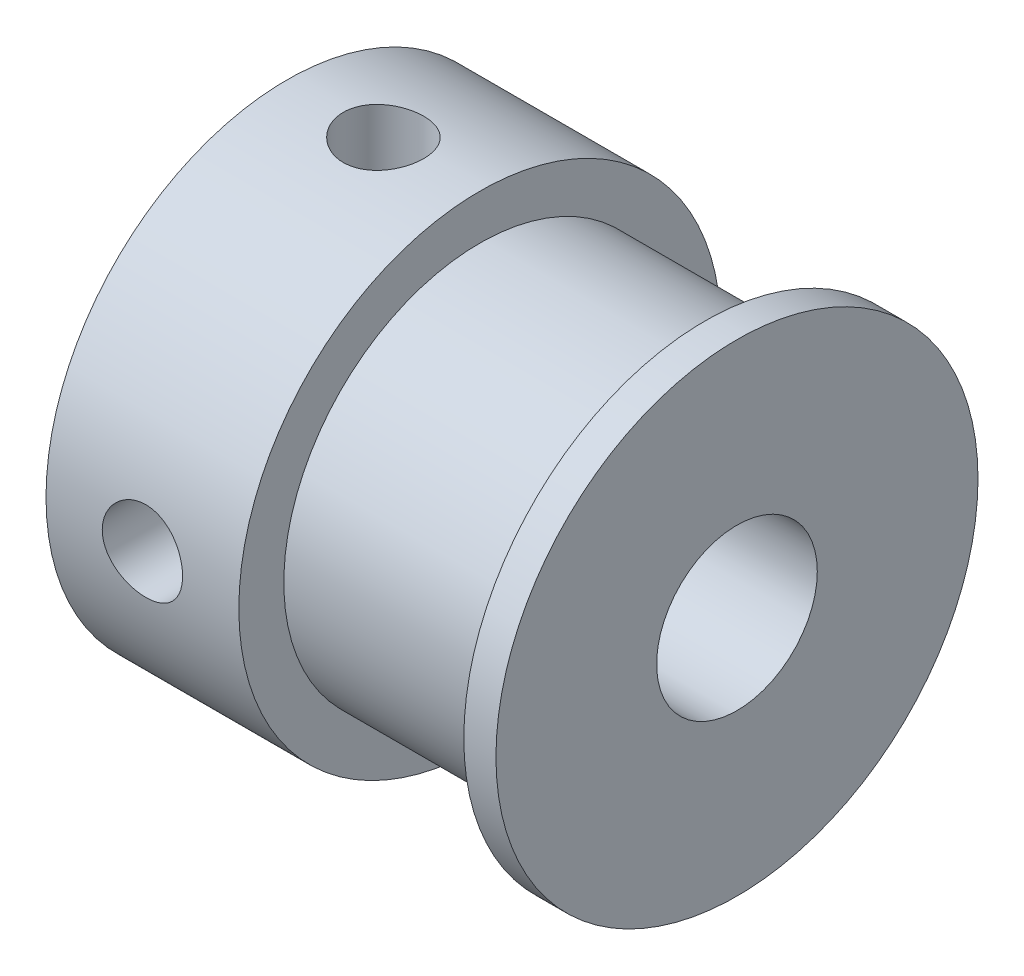
ISO-10303-21;
HEADER;
FILE_DESCRIPTION(('STEP AP214'),'2;1');
FILE_NAME('part.step','',(''),(''),'','','');
FILE_SCHEMA(('AUTOMOTIVE_DESIGN { 1 0 10303 214 1 1 1 1 }'));
ENDSEC;
DATA;
#1=APPLICATION_CONTEXT('core data for automotive mechanical design processes');
#2=APPLICATION_PROTOCOL_DEFINITION('international standard','automotive_design',2000,#1);
#3=PRODUCT_CONTEXT('',#1,'mechanical');
#4=PRODUCT('Part','Part','',(#3));
#5=PRODUCT_RELATED_PRODUCT_CATEGORY('part','',(#4));
#6=PRODUCT_DEFINITION_FORMATION('','',#4);
#7=PRODUCT_DEFINITION_CONTEXT('part definition',#1,'design');
#8=PRODUCT_DEFINITION('design','',#6,#7);
#9=PRODUCT_DEFINITION_SHAPE('','',#8);
#10=(LENGTH_UNIT() NAMED_UNIT(*) SI_UNIT(.MILLI.,.METRE.));
#11=(NAMED_UNIT(*) PLANE_ANGLE_UNIT() SI_UNIT($,.RADIAN.));
#12=(NAMED_UNIT(*) SI_UNIT($,.STERADIAN.) SOLID_ANGLE_UNIT());
#13=UNCERTAINTY_MEASURE_WITH_UNIT(LENGTH_MEASURE(1.E-05),#10,'distance_accuracy_value','');
#14=(GEOMETRIC_REPRESENTATION_CONTEXT(3) GLOBAL_UNCERTAINTY_ASSIGNED_CONTEXT((#13)) GLOBAL_UNIT_ASSIGNED_CONTEXT((#10,
#11,#12)) REPRESENTATION_CONTEXT('',''));
#15=CARTESIAN_POINT('',(0.,0.,0.));
#16=DIRECTION('',(0.,0.,1.));
#17=DIRECTION('',(1.,0.,0.));
#18=AXIS2_PLACEMENT_3D('',#15,#16,#17);
#19=CARTESIAN_POINT('',(0.,0.,0.));
#20=DIRECTION('',(1.,0.,0.));
#21=DIRECTION('',(0.,0.,-1.));
#22=AXIS2_PLACEMENT_3D('',#19,#20,#21);
#23=CYLINDRICAL_SURFACE('',#22,2.5);
#24=CARTESIAN_POINT('',(1.75000000000001,0.,2.5));
#25=CARTESIAN_POINT('',(1.75000412789938,0.0657149536912327,2.49999641755189));
#26=CARTESIAN_POINT('',(1.7552125914021,0.13150824962254,2.49738113774397));
#27=CARTESIAN_POINT('',(1.77581610042615,0.26115029408553,2.48717695046745));
#28=CARTESIAN_POINT('',(1.79123049124707,0.324995108391878,2.4795785978623));
#29=CARTESIAN_POINT('',(1.831492260771,0.448666931100716,2.4602034925414));
#30=CARTESIAN_POINT('',(1.85630298031002,0.508508503673972,2.448442989719));
#31=CARTESIAN_POINT('',(1.91446327670618,0.623090771008203,2.42182220644723));
#32=CARTESIAN_POINT('',(1.94781218031107,0.677831867487559,2.40696217041913));
#33=CARTESIAN_POINT('',(2.02439656185663,0.784384772202394,2.37445322822571));
#34=CARTESIAN_POINT('',(2.06810809904956,0.835819013902635,2.3566899890942));
#35=CARTESIAN_POINT('',(2.1631518490588,0.930974306083716,2.32074962808431));
#36=CARTESIAN_POINT('',(2.21448981471555,0.974689478883452,2.30257220261294));
#37=CARTESIAN_POINT('',(2.32810418690423,1.05656500056284,2.26623688996684));
#38=CARTESIAN_POINT('',(2.39092012293239,1.09403166943954,2.24818983712665));
#39=CARTESIAN_POINT('',(2.52295916998277,1.15771028361336,2.21607473465401));
#40=CARTESIAN_POINT('',(2.59217766090344,1.18393026870791,2.20200384508737));
#41=CARTESIAN_POINT('',(2.73083138177741,1.22266555273573,2.18072333797261));
#42=CARTESIAN_POINT('',(2.80000556508424,1.23590732135054,2.17315339479642));
#43=CARTESIAN_POINT('',(2.93997354722435,1.25053374163605,2.1647736243566));
#44=CARTESIAN_POINT('',(3.01076567608894,1.25193011046634,2.16395711679111));
#45=CARTESIAN_POINT('',(3.14285753039421,1.24335910896536,2.16888662821561));
#46=CARTESIAN_POINT('',(3.20428003902881,1.23473069942102,2.17385954577517));
#47=CARTESIAN_POINT('',(3.3246523867163,1.20867481132116,2.18845285917313));
#48=CARTESIAN_POINT('',(3.38360143163164,1.19124452987206,2.19807473539721));
#49=CARTESIAN_POINT('',(3.49903641570707,1.1477622254825,2.22109345515927));
#50=CARTESIAN_POINT('',(3.55543299848223,1.12151883389499,2.23457300829999));
#51=CARTESIAN_POINT('',(3.66329286573751,1.061302109585,2.26379255351755));
#52=CARTESIAN_POINT('',(3.71475391950011,1.02732530476558,2.27953355975239));
#53=CARTESIAN_POINT('',(3.81815156592903,0.94758256864098,2.31391447379108));
#54=CARTESIAN_POINT('',(3.86932109197019,0.900868072961596,2.33266887795933));
#55=CARTESIAN_POINT('',(3.96341927323862,0.799444473426712,2.36934529125509));
#56=CARTESIAN_POINT('',(4.00634399004235,0.744731570717852,2.38726689948501));
#57=CARTESIAN_POINT('',(4.08460707628715,0.625645632289807,2.42127484103705));
#58=CARTESIAN_POINT('',(4.11950059055717,0.560941989499257,2.43723730202509));
#59=CARTESIAN_POINT('',(4.17762128630375,0.425582769360993,2.46447351401553));
#60=CARTESIAN_POINT('',(4.20085773126895,0.354931970331593,2.47575098679441));
#61=CARTESIAN_POINT('',(4.23309425464584,0.215958114575875,2.49155417176795));
#62=CARTESIAN_POINT('',(4.24311404468347,0.147926913185404,2.4965617287664));
#63=CARTESIAN_POINT('',(4.2518309139181,0.0109744999366913,2.50091266823877));
#64=CARTESIAN_POINT('',(4.25053335704934,-0.057946274837377,2.5002587340164));
#65=CARTESIAN_POINT('',(4.23724163947655,-0.189041214982492,2.49363990316801));
#66=CARTESIAN_POINT('',(4.22608433408745,-0.251324260062442,2.48809057110237));
#67=CARTESIAN_POINT('',(4.19470241013114,-0.373008615377395,2.47277714143524));
#68=CARTESIAN_POINT('',(4.1744767919333,-0.432409607113745,2.46301257917916));
#69=CARTESIAN_POINT('',(4.12500191695853,-0.548610760562079,2.43980314267087));
#70=CARTESIAN_POINT('',(4.09551118735398,-0.605287996257689,2.42626102212424));
#71=CARTESIAN_POINT('',(4.02861558044244,-0.713076702123648,2.39679967896386));
#72=CARTESIAN_POINT('',(3.9912073317582,-0.764185787219099,2.38087944457232));
#73=CARTESIAN_POINT('',(3.9052994683339,-0.864709611613313,2.34635276671831));
#74=CARTESIAN_POINT('',(3.85607141443304,-0.913465097280795,2.32763606060552));
#75=CARTESIAN_POINT('',(3.75009356091336,-1.00232040139154,2.29077989504843));
#76=CARTESIAN_POINT('',(3.69333860147953,-1.04241423211355,2.27264084226908));
#77=CARTESIAN_POINT('',(3.57044543224961,-1.11463489312211,2.23813990282585));
#78=CARTESIAN_POINT('',(3.50398591723925,-1.14628186984829,2.2219066207934));
#79=CARTESIAN_POINT('',(3.36561241538434,-1.19760353251725,2.19467590460158));
#80=CARTESIAN_POINT('',(3.29370559187351,-1.21729364485946,2.18367172800773));
#81=CARTESIAN_POINT('',(3.15386222142319,-1.24232710931209,2.16951876260834));
#82=CARTESIAN_POINT('',(3.0862071832137,-1.24886624550107,2.16571729325614));
#83=CARTESIAN_POINT('',(2.95069116603659,-1.25086144297598,2.16456693307719));
#84=CARTESIAN_POINT('',(2.88283028907571,-1.24632230828049,2.16721524534441));
#85=CARTESIAN_POINT('',(2.75564562308498,-1.22740765699032,2.17797327562531));
#86=CARTESIAN_POINT('',(2.6961244123195,-1.21401039292849,2.18553868102992));
#87=CARTESIAN_POINT('',(2.58023985071912,-1.1789691977808,2.20463770234897));
#88=CARTESIAN_POINT('',(2.52387752238504,-1.15732261394975,2.21617259462095));
#89=CARTESIAN_POINT('',(2.41171893626674,-1.10476968162585,2.2428566295566));
#90=CARTESIAN_POINT('',(2.35621512271288,-1.07333892227057,2.25819652995239));
#91=CARTESIAN_POINT('',(2.25090682977427,-1.00268871454579,2.29044164543238));
#92=CARTESIAN_POINT('',(2.20110533685189,-0.963465214048303,2.30734767243153));
#93=CARTESIAN_POINT('',(2.10232252205298,-0.872754158330795,2.34327903949142));
#94=CARTESIAN_POINT('',(2.0541761220476,-0.820355528762707,2.36231229139336));
#95=CARTESIAN_POINT('',(1.96717127072046,-0.707693507775343,2.3984719031886));
#96=CARTESIAN_POINT('',(1.92831782571714,-0.647425904070975,2.4155972326005));
#97=CARTESIAN_POINT('',(1.86095454654725,-0.519914496024928,2.44622511981379));
#98=CARTESIAN_POINT('',(1.83251978823571,-0.452624379918263,2.45970120703636));
#99=CARTESIAN_POINT('',(1.78773979010132,-0.313427626617735,2.48126676704332));
#100=CARTESIAN_POINT('',(1.77136019146303,-0.241534749528953,2.48937154216165));
#101=CARTESIAN_POINT('',(1.7576282361552,-0.140752433104227,2.49619327387079));
#102=CARTESIAN_POINT('',(1.75477169892048,-0.112702349299371,2.49761706674002));
#103=CARTESIAN_POINT('',(1.750956668104,-0.0564396647589458,2.49952121222331));
#104=CARTESIAN_POINT('',(1.74999822691101,-0.0282270595592261,2.50000153879704));
#105=CARTESIAN_POINT('',(1.75000000000001,0.,2.5));
#106=B_SPLINE_CURVE_WITH_KNOTS('',3,(#24,#25,#26,#27,#28,#29,#30,#31,#32,#33,#34,#35,#36,#37,
#38,#39,#40,#41,#42,#43,#44,#45,#46,#47,#48,#49,#50,#51,#52,#53,#54,#55,#56,#57,#58,#59,#60,#61,
#62,#63,#64,#65,#66,#67,#68,#69,#70,#71,#72,#73,#74,#75,#76,#77,#78,#79,#80,#81,#82,#83,#84,#85,
#86,#87,#88,#89,#90,#91,#92,#93,#94,#95,#96,#97,#98,#99,#100,#101,#102,#103,#104,#105),
.UNSPECIFIED.,.T.,.F.,(4,2,2,2,2,2,2,2,2,2,2,2,2,2,2,2,2,2,2,2,2,2,2,2,2,2,2,2,2,2,2,2,2,2,2,2,
2,2,2,2,4),(0.,0.197030321775364,0.394435187136495,0.59107769436537,0.787704700726955,
0.996227198397605,1.20490779706754,1.4297715803844,1.6544743487285,1.86572515175286,
2.07676696661274,2.26257140511649,2.44843504907097,2.63862800210608,2.82890651575276,
3.04331176667346,3.25781918248356,3.48228777768049,3.70657771140347,3.9122911308918,
4.11790705639343,4.3075863313265,4.49728652038662,4.69241070034871,4.88761813435421,
5.10199513305521,5.31651985769287,5.54143352699589,5.76605639925969,5.96911634372963,
6.17208824825003,6.35572412805225,6.53941910979594,6.73545570969514,6.93159451423693,
7.15156553440619,7.37165479220712,7.59330017078652,7.81431135781158,7.89894100172117,
7.98357298143554),.UNSPECIFIED.);
#107=CARTESIAN_POINT('',(1.75000000000001,0.,2.5));
#108=VERTEX_POINT('',#107);
#109=EDGE_CURVE('E83',#108,#108,#106,.T.);
#110=ORIENTED_EDGE('',*,*,#109,.F.);
#111=EDGE_LOOP('',(#110));
#112=FACE_BOUND('',#111,.T.);
#113=CARTESIAN_POINT('',(3.,2.1650635094611,-1.25));
#114=CARTESIAN_POINT('',(3.06513476024406,2.16506918410574,-1.24999545384316));
#115=CARTESIAN_POINT('',(3.13035176440631,2.16804751484696,-1.24487496341652));
#116=CARTESIAN_POINT('',(3.25878408084644,2.17952958065066,-1.22465401237257));
#117=CARTESIAN_POINT('',(3.32199489380426,2.18804492569449,-1.20953258069272));
#118=CARTESIAN_POINT('',(3.44431458042993,2.20936683256748,-1.17012493587476));
#119=CARTESIAN_POINT('',(3.50344331559198,2.22215054341565,-1.14588744061716));
#120=CARTESIAN_POINT('',(3.6167802524959,2.25053331021072,-1.08908440672046));
#121=CARTESIAN_POINT('',(3.67098818782807,2.26613251845081,-1.05651841754472));
#122=CARTESIAN_POINT('',(3.77788216069688,2.29996086321802,-0.980833175663598));
#123=CARTESIAN_POINT('',(3.83007391959193,2.31830079547442,-0.937065045179713));
#124=CARTESIAN_POINT('',(3.92676048550839,2.35464978482132,-0.841567259518085));
#125=CARTESIAN_POINT('',(3.9712514532294,2.37265867289062,-0.789833657227866));
#126=CARTESIAN_POINT('',(4.05420893893458,2.40776846191186,-0.675611954268182));
#127=CARTESIAN_POINT('',(4.09206720982441,2.42472633022716,-0.612633986265718));
#128=CARTESIAN_POINT('',(4.1564260665572,2.45438445124411,-0.48019628324938));
#129=CARTESIAN_POINT('',(4.18293382017146,2.46708738979677,-0.410740672672694));
#130=CARTESIAN_POINT('',(4.22188082662637,2.48600576555297,-0.272556179907471));
#131=CARTESIAN_POINT('',(4.23518690794442,2.49261850276115,-0.204127238111022));
#132=CARTESIAN_POINT('',(4.2502076483438,2.50009479807584,-0.0657132858723104));
#133=CARTESIAN_POINT('',(4.25192932099464,2.50096183480737,0.00427075730467264));
#134=CARTESIAN_POINT('',(4.24406665753706,2.49703727395563,0.137290655529687));
#135=CARTESIAN_POINT('',(4.23545248059847,2.49273119865201,0.200401498970989));
#136=CARTESIAN_POINT('',(4.20889894511918,2.47967806574684,0.324142214897902));
#137=CARTESIAN_POINT('',(4.19095888877972,2.47093067582992,0.384771901367406));
#138=CARTESIAN_POINT('',(4.14614679238773,2.44964479109568,0.502886739461942));
#139=CARTESIAN_POINT('',(4.11915460853491,2.43705551911499,0.560316779393972));
#140=CARTESIAN_POINT('',(4.05717072974813,2.40922057483359,0.66997100189166));
#141=CARTESIAN_POINT('',(4.02217617087206,2.39397395196855,0.722193311048307));
#142=CARTESIAN_POINT('',(3.94138081058373,2.36055492999037,0.825217076122743));
#143=CARTESIAN_POINT('',(3.89487121459249,2.34224219997719,0.8754175937867));
#144=CARTESIAN_POINT('',(3.79426284383728,2.30567925733515,0.967630462872225));
#145=CARTESIAN_POINT('',(3.74015828465742,2.28742910332036,1.00963651446779));
#146=CARTESIAN_POINT('',(3.62168975946989,2.25180195115606,1.08688166830276));
#147=CARTESIAN_POINT('',(3.55689247118223,2.23455399988385,1.12152164372256));
#148=CARTESIAN_POINT('',(3.42132791080125,2.2046931284822,1.17914889125154));
#149=CARTESIAN_POINT('',(3.35056695872805,2.19207537557584,1.20214832276361));
#150=CARTESIAN_POINT('',(3.21098186089651,2.17430794771293,1.2339752637813));
#151=CARTESIAN_POINT('',(3.14244860119556,2.16864569810621,1.24378140264997));
#152=CARTESIAN_POINT('',(3.00449832310432,2.16397399202012,1.25189618326428));
#153=CARTESIAN_POINT('',(2.93508196360027,2.1649598361164,1.25021294664378));
#154=CARTESIAN_POINT('',(2.80543260177659,2.17292920675731,1.23629505417996));
#155=CARTESIAN_POINT('',(2.74502568611509,2.17924484383318,1.22523477089058));
#156=CARTESIAN_POINT('',(2.6270402671613,2.19617526939176,1.19462035579055));
#157=CARTESIAN_POINT('',(2.56946268656674,2.20679145006292,1.17506347327952));
#158=CARTESIAN_POINT('',(2.45573583637163,2.23170277599571,1.12705948575611));
#159=CARTESIAN_POINT('',(2.39977622893306,2.24614554053829,1.0982425796159));
#160=CARTESIAN_POINT('',(2.29316341057626,2.27695149371562,1.03285883001975));
#161=CARTESIAN_POINT('',(2.2425129456084,2.29331566693935,0.99628800541527));
#162=CARTESIAN_POINT('',(2.14127654059557,2.3285999807042,0.911046458998566));
#163=CARTESIAN_POINT('',(2.09150356160293,2.34758228942861,0.861431590393708));
#164=CARTESIAN_POINT('',(2.00073470250801,2.38417793722366,0.75425561924786));
#165=CARTESIAN_POINT('',(1.95974178721183,2.40179081259637,0.696691843319183));
#166=CARTESIAN_POINT('',(1.88678284256237,2.43426702113696,0.573169203198446));
#167=CARTESIAN_POINT('',(1.85508360223636,2.44904552090037,0.507028871967641));
#168=CARTESIAN_POINT('',(1.80357762017826,2.47354193699126,0.369402955801352));
#169=CARTESIAN_POINT('',(1.78376043579212,2.48326429595466,0.29792212674022));
#170=CARTESIAN_POINT('',(1.75828929478167,2.49584385227353,0.158724602913021));
#171=CARTESIAN_POINT('',(1.75150265515486,2.49924909885239,0.0912643048130715));
#172=CARTESIAN_POINT('',(1.748945918182,2.50052662968914,-0.0439074824390041));
#173=CARTESIAN_POINT('',(1.75317196434555,2.49840085083612,-0.111618875368858));
#174=CARTESIAN_POINT('',(1.77177050849453,2.48917461047403,-0.240672490396433));
#175=CARTESIAN_POINT('',(1.78545606157209,2.48241118334987,-0.302140397264079));
#176=CARTESIAN_POINT('',(1.82165874912871,2.46490117079279,-0.421807440229521));
#177=CARTESIAN_POINT('',(1.84417715011682,2.45415401415995,-0.480006106194385));
#178=CARTESIAN_POINT('',(1.89840881520747,2.4290741343515,-0.594279257806105));
#179=CARTESIAN_POINT('',(1.9304741540098,2.41460771498499,-0.650156428375057));
#180=CARTESIAN_POINT('',(2.00244741357381,2.38360166427283,-0.75596830226753));
#181=CARTESIAN_POINT('',(2.04235893639459,2.36706108197951,-0.805900259268633));
#182=CARTESIAN_POINT('',(2.13349642377838,2.33160762783285,-0.903642505196113));
#183=CARTESIAN_POINT('',(2.18545310934649,2.31262248764622,-0.950747105674089));
#184=CARTESIAN_POINT('',(2.29681340141221,2.27578845203566,-1.03582910924334));
#185=CARTESIAN_POINT('',(2.35622352608461,2.25794057202332,-1.07379843751257));
#186=CARTESIAN_POINT('',(2.48329580822619,2.22499506631145,-1.14053884973207));
#187=CARTESIAN_POINT('',(2.55115941391092,2.21000217820338,-1.16898133245117));
#188=CARTESIAN_POINT('',(2.69166550542472,2.1858269541044,-1.21359838688301));
#189=CARTESIAN_POINT('',(2.76429111114086,2.17662520184628,-1.22981398896918));
#190=CARTESIAN_POINT('',(2.864756694565,2.16911590752238,-1.24295875983052));
#191=CARTESIAN_POINT('',(2.89170986799735,2.1676016125644,-1.24559513120481));
#192=CARTESIAN_POINT('',(2.9457706008528,2.16557419859688,-1.24911675636245));
#193=CARTESIAN_POINT('',(2.97287817048234,2.16506114656387,-1.25000189299984));
#194=CARTESIAN_POINT('',(3.,2.1650635094611,-1.25));
#195=B_SPLINE_CURVE_WITH_KNOTS('',3,(#113,#114,#115,#116,#117,#118,#119,#120,#121,#122,#123,
#124,#125,#126,#127,#128,#129,#130,#131,#132,#133,#134,#135,#136,#137,#138,#139,#140,#141,#142,
#143,#144,#145,#146,#147,#148,#149,#150,#151,#152,#153,#154,#155,#156,#157,#158,#159,#160,#161,
#162,#163,#164,#165,#166,#167,#168,#169,#170,#171,#172,#173,#174,#175,#176,#177,#178,#179,#180,
#181,#182,#183,#184,#185,#186,#187,#188,#189,#190,#191,#192,#193,#194),.UNSPECIFIED.,.T.,.F.,(4,
2,2,2,2,2,2,2,2,2,2,2,2,2,2,2,2,2,2,2,2,2,2,2,2,2,2,2,2,2,2,2,2,2,2,2,2,2,2,2,4),(0.,
0.195290153243394,0.390991116031005,0.585660744898606,0.780340906806436,0.99107789062279,
1.20191963855464,1.42697365298454,1.65188533704864,1.86079356209919,2.0695752960755,
2.26020121855673,2.45084140646819,2.64411918413933,2.8374662418784,3.04908989321113,
3.26087560307398,3.4861105216181,3.71110967764631,3.91827863567764,4.12530116485466,
4.30967729280032,4.49411315545078,4.68709120507609,4.88016857775059,5.09758429475766,
5.31507331222752,5.53830226766207,5.76133474760964,5.96390337986858,6.16640108492464,
6.35555531089365,6.54473666890016,6.74200938399339,6.93937287625898,7.15637802312584,
7.37357428556442,7.59763436298256,7.8209391625345,7.90225168981636,7.98356965618175),.UNSPECIFIED.);
#196=CARTESIAN_POINT('',(3.,2.1650635094611,-1.25));
#197=VERTEX_POINT('',#196);
#198=EDGE_CURVE('E75',#197,#197,#195,.T.);
#199=ORIENTED_EDGE('',*,*,#198,.F.);
#200=EDGE_LOOP('',(#199));
#201=FACE_BOUND('',#200,.T.);
#202=CARTESIAN_POINT('',(14.,0.,0.));
#203=DIRECTION('',(1.,0.,0.));
#204=DIRECTION('',(0.,0.,-1.));
#205=AXIS2_PLACEMENT_3D('',#202,#203,#204);
#206=CIRCLE('',#205,2.5);
#207=CARTESIAN_POINT('',(14.,0.,-2.5));
#208=VERTEX_POINT('',#207);
#209=EDGE_CURVE('E82',#208,#208,#206,.T.);
#210=ORIENTED_EDGE('',*,*,#209,.T.);
#211=EDGE_LOOP('',(#210));
#212=FACE_BOUND('',#211,.T.);
#213=CARTESIAN_POINT('',(0.,0.,0.));
#214=DIRECTION('',(1.,0.,0.));
#215=DIRECTION('',(0.,0.,-1.));
#216=AXIS2_PLACEMENT_3D('',#213,#214,#215);
#217=CIRCLE('',#216,2.5);
#218=CARTESIAN_POINT('',(0.,0.,-2.5));
#219=VERTEX_POINT('',#218);
#220=EDGE_CURVE('E50',#219,#219,#217,.T.);
#221=ORIENTED_EDGE('',*,*,#220,.F.);
#222=EDGE_LOOP('',(#221));
#223=FACE_BOUND('',#222,.T.);
#224=ADVANCED_FACE('F34',(#112,#201,#212,#223),#23,.F.);
#225=CARTESIAN_POINT('',(0.,2.5,0.));
#226=DIRECTION('',(-1.,0.,0.));
#227=DIRECTION('',(0.,0.,1.));
#228=AXIS2_PLACEMENT_3D('',#225,#226,#227);
#229=PLANE('',#228);
#230=ORIENTED_EDGE('',*,*,#220,.T.);
#231=EDGE_LOOP('',(#230));
#232=FACE_BOUND('',#231,.T.);
#233=CARTESIAN_POINT('',(0.,0.,0.));
#234=DIRECTION('',(1.,0.,0.));
#235=DIRECTION('',(0.,0.,-1.));
#236=AXIS2_PLACEMENT_3D('',#233,#234,#235);
#237=CIRCLE('',#236,7.5);
#238=CARTESIAN_POINT('',(0.,0.,-7.5));
#239=VERTEX_POINT('',#238);
#240=EDGE_CURVE('E54',#239,#239,#237,.T.);
#241=ORIENTED_EDGE('',*,*,#240,.F.);
#242=EDGE_LOOP('',(#241));
#243=FACE_BOUND('',#242,.T.);
#244=ADVANCED_FACE('F108',(#232,#243),#229,.T.);
#245=CARTESIAN_POINT('',(0.,0.,0.));
#246=DIRECTION('',(1.,0.,0.));
#247=DIRECTION('',(0.,0.,-1.));
#248=AXIS2_PLACEMENT_3D('',#245,#246,#247);
#249=CYLINDRICAL_SURFACE('',#248,7.5);
#250=CARTESIAN_POINT('',(1.75000000000001,0.,7.5));
#251=CARTESIAN_POINT('',(1.75000279447392,-0.069695452479107,7.49999880584412));
#252=CARTESIAN_POINT('',(1.75584863748447,-0.13942894091941,7.49901838956517));
#253=CARTESIAN_POINT('',(1.77906782938267,-0.27694011083652,7.49520172470694));
#254=CARTESIAN_POINT('',(1.79645177845581,-0.344715933979622,7.49236376961945));
#255=CARTESIAN_POINT('',(1.84220772429638,-0.476302373606319,7.48515034118225));
#256=CARTESIAN_POINT('',(1.87057073282029,-0.540116184215947,7.48077612579597));
#257=CARTESIAN_POINT('',(1.9374561460262,-0.662070920988969,7.47097113541035));
#258=CARTESIAN_POINT('',(1.9759773887415,-0.720212494939292,7.46554048127217));
#259=CARTESIAN_POINT('',(2.06247754191024,-0.829736307145835,7.45416658729157));
#260=CARTESIAN_POINT('',(2.11053455731807,-0.881056451767479,7.44821935907428));
#261=CARTESIAN_POINT('',(2.21457398423641,-0.974944249329958,7.43651313438366));
#262=CARTESIAN_POINT('',(2.27055689572831,-1.01751134969548,7.43075414981334));
#263=CARTESIAN_POINT('',(2.38928548309853,-1.09293356280256,7.4200378287989));
#264=CARTESIAN_POINT('',(2.45207066840238,-1.12572727643049,7.41508564545818));
#265=CARTESIAN_POINT('',(2.58235478215032,-1.1802791827056,7.40659894897337));
#266=CARTESIAN_POINT('',(2.64985339183882,-1.2020381207828,7.40306434007154));
#267=CARTESIAN_POINT('',(2.78699013742827,-1.2337071888924,7.39785268421378));
#268=CARTESIAN_POINT('',(2.8566028682507,-1.24372451456769,7.3961588424285));
#269=CARTESIAN_POINT('',(2.99654013844174,-1.25195836264493,7.39476969468325));
#270=CARTESIAN_POINT('',(3.06686462708365,-1.25017572019449,7.39507424728607));
#271=CARTESIAN_POINT('',(3.20546393063772,-1.23494754919807,7.39763214431778));
#272=CARTESIAN_POINT('',(3.27375240177262,-1.22162244094488,7.39986536659458));
#273=CARTESIAN_POINT('',(3.40711065891456,-1.18387657020172,7.40599747605504));
#274=CARTESIAN_POINT('',(3.47218033444427,-1.15945542715986,7.40989642036636));
#275=CARTESIAN_POINT('',(3.59761441172046,-1.10008862304695,7.4189423966705));
#276=CARTESIAN_POINT('',(3.65795470304061,-1.06509295693985,7.42409533553663));
#277=CARTESIAN_POINT('',(3.77195220026919,-0.985606008778711,7.43506459207505));
#278=CARTESIAN_POINT('',(3.82560886622746,-0.941113960327138,7.44088096327143));
#279=CARTESIAN_POINT('',(3.92541304290367,-0.843241106079522,7.45261013939893));
#280=CARTESIAN_POINT('',(3.97145925927004,-0.789756981936559,7.45852324615826));
#281=CARTESIAN_POINT('',(4.05393888133267,-0.675767624490819,7.46971300698362));
#282=CARTESIAN_POINT('',(4.09037222509161,-0.615262345953207,7.47498965694873));
#283=CARTESIAN_POINT('',(4.15260111356814,-0.488852958083352,7.48431946446456));
#284=CARTESIAN_POINT('',(4.17838770966562,-0.422944362782327,7.48837159203724));
#285=CARTESIAN_POINT('',(4.21849710762298,-0.287649172801363,7.4947875150633));
#286=CARTESIAN_POINT('',(4.23282086848685,-0.218262869589732,7.49715145175237));
#287=CARTESIAN_POINT('',(4.24946067923056,-0.0788549506508106,7.49990564921343));
#288=CARTESIAN_POINT('',(4.2519157859028,-0.0088503685755048,7.50031876506392));
#289=CARTESIAN_POINT('',(4.24511932778593,0.130569886444944,7.49918737210585));
#290=CARTESIAN_POINT('',(4.23586821343312,0.199985581946019,7.49764293862059));
#291=CARTESIAN_POINT('',(4.20603757533225,0.33582808777338,7.49278413469101));
#292=CARTESIAN_POINT('',(4.18552689580493,0.402270434192688,7.48948052400655));
#293=CARTESIAN_POINT('',(4.13383274090023,0.530773442430219,7.48147232227679));
#294=CARTESIAN_POINT('',(4.10264866618236,0.592833857954856,7.4767676525601));
#295=CARTESIAN_POINT('',(4.0301744376516,0.711415344734475,7.46642258151204));
#296=CARTESIAN_POINT('',(3.98879742191637,0.76788262546857,7.46077427943511));
#297=CARTESIAN_POINT('',(3.89723134230746,0.873121792751339,7.4491923369595));
#298=CARTESIAN_POINT('',(3.84704163836166,0.921893119848286,7.44325867585773));
#299=CARTESIAN_POINT('',(3.73865122596428,1.01087138982899,7.43170087617923));
#300=CARTESIAN_POINT('',(3.68037291724279,1.05098438055685,7.42608058068553));
#301=CARTESIAN_POINT('',(3.55782351543073,1.12085115514749,7.41585764888942));
#302=CARTESIAN_POINT('',(3.49355261238625,1.1506052673849,7.4112549803301));
#303=CARTESIAN_POINT('',(3.36110513359393,1.19876916573657,7.40361726848852));
#304=CARTESIAN_POINT('',(3.29294595248475,1.21722571627397,7.40057577155532));
#305=CARTESIAN_POINT('',(3.15443993538912,1.24241772688913,7.3963885841763));
#306=CARTESIAN_POINT('',(3.08409329013397,1.24915420597308,7.39524272891361));
#307=CARTESIAN_POINT('',(2.9441474170188,1.25068643302367,7.39498366542006));
#308=CARTESIAN_POINT('',(2.87454981071236,1.24563006806259,7.39584528252825));
#309=CARTESIAN_POINT('',(2.73721037597462,1.22403991947842,7.39944890726864));
#310=CARTESIAN_POINT('',(2.66946854152907,1.20750617305623,7.40219090880607));
#311=CARTESIAN_POINT('',(2.5378207813537,1.16348724479744,7.40923678140859));
#312=CARTESIAN_POINT('',(2.47391049497199,1.13601479530021,7.41353883609835));
#313=CARTESIAN_POINT('',(2.35158216540258,1.07091350195795,7.42322184461104));
#314=CARTESIAN_POINT('',(2.29316439481394,1.03328415437427,7.428602851942));
#315=CARTESIAN_POINT('',(2.18273220844613,0.948409442186072,7.43991727022811));
#316=CARTESIAN_POINT('',(2.13080199164987,0.901055281796818,7.44585647788151));
#317=CARTESIAN_POINT('',(2.03557419776254,0.79830451569011,7.45757186180421));
#318=CARTESIAN_POINT('',(1.99227861568092,0.742906056456313,7.46334800013273));
#319=CARTESIAN_POINT('',(1.91527586590003,0.625184584820136,7.4741326482111));
#320=CARTESIAN_POINT('',(1.88163698034353,0.562816393766405,7.47913558126552));
#321=CARTESIAN_POINT('',(1.82536525769505,0.433256534689487,7.48775583800888));
#322=CARTESIAN_POINT('',(1.80272145946016,0.366069747415002,7.49137454088741));
#323=CARTESIAN_POINT('',(1.77399736293667,0.248851655022698,7.49602895416478));
#324=CARTESIAN_POINT('',(1.76501276519202,0.199529415149222,7.49751013636679));
#325=CARTESIAN_POINT('',(1.75301313107763,0.100144655159903,7.4994960799306));
#326=CARTESIAN_POINT('',(1.74999799193133,0.0500821478042465,7.50000085810321));
#327=CARTESIAN_POINT('',(1.75000000000001,0.,7.5));
#328=B_SPLINE_CURVE_WITH_KNOTS('',3,(#250,#251,#252,#253,#254,#255,#256,#257,#258,#259,#260,
#261,#262,#263,#264,#265,#266,#267,#268,#269,#270,#271,#272,#273,#274,#275,#276,#277,#278,#279,
#280,#281,#282,#283,#284,#285,#286,#287,#288,#289,#290,#291,#292,#293,#294,#295,#296,#297,#298,
#299,#300,#301,#302,#303,#304,#305,#306,#307,#308,#309,#310,#311,#312,#313,#314,#315,#316,#317,
#318,#319,#320,#321,#322,#323,#324,#325,#326,#327),.UNSPECIFIED.,.T.,.F.,(4,2,2,2,2,2,2,2,2,2,2,
2,2,2,2,2,2,2,2,2,2,2,2,2,2,2,2,2,2,2,2,2,2,2,2,2,2,2,4),(0.,0.208903292469254,
0.417998772847708,0.626923433512632,0.835824206337391,1.04651245531165,1.25721400084928,
1.46921260411919,1.6811968843809,1.89123038551711,2.10124902160442,2.30910260880203,
2.51696332512689,2.72582278316277,2.93469910340285,3.14616384955662,3.35762995817922,
3.5692734445795,3.78089922260572,3.99003941745696,4.19917156517927,4.40703903503205,
4.61491817913031,4.82463412813509,5.03436531527139,5.24626911003807,5.45816618687968,
5.66918011170883,5.88017568893306,6.08853954761347,6.29690273094063,6.50502409113108,
6.71315577514664,6.92375692096692,7.13440666939482,7.34651115803596,7.55840376065032,
7.70852124082005,7.85863613638479),.UNSPECIFIED.);
#329=CARTESIAN_POINT('',(1.75000000000001,0.,7.5));
#330=VERTEX_POINT('',#329);
#331=EDGE_CURVE('E10',#330,#330,#328,.T.);
#332=ORIENTED_EDGE('',*,*,#331,.F.);
#333=EDGE_LOOP('',(#332));
#334=FACE_BOUND('',#333,.T.);
#335=CARTESIAN_POINT('',(4.25,7.5,0.));
#336=CARTESIAN_POINT('',(4.24999720552609,7.49999880584412,-0.0696954524791073));
#337=CARTESIAN_POINT('',(4.24415136251554,7.49901838956517,-0.13942894091941));
#338=CARTESIAN_POINT('',(4.22093217061734,7.49520172470694,-0.276940110836521));
#339=CARTESIAN_POINT('',(4.2035482215442,7.49236376961945,-0.344715933979623));
#340=CARTESIAN_POINT('',(4.15779227570362,7.48515034118225,-0.476302373606321));
#341=CARTESIAN_POINT('',(4.12942926717971,7.48077612579596,-0.54011618421595));
#342=CARTESIAN_POINT('',(4.0625438539738,7.47097113541035,-0.662070920988972));
#343=CARTESIAN_POINT('',(4.0240226112585,7.46554048127217,-0.720212494939295));
#344=CARTESIAN_POINT('',(3.93752245808977,7.45416658729156,-0.829736307145839));
#345=CARTESIAN_POINT('',(3.88946544268193,7.44821935907428,-0.881056451767483));
#346=CARTESIAN_POINT('',(3.78542601576359,7.43651313438366,-0.974944249329963));
#347=CARTESIAN_POINT('',(3.72944310427169,7.43075414981334,-1.01751134969548));
#348=CARTESIAN_POINT('',(3.61071451690147,7.4200378287989,-1.09293356280257));
#349=CARTESIAN_POINT('',(3.54792933159762,7.41508564545818,-1.1257272764305));
#350=CARTESIAN_POINT('',(3.41764521784969,7.40659894897337,-1.18027918270561));
#351=CARTESIAN_POINT('',(3.35014660816118,7.40306434007154,-1.20203812078281));
#352=CARTESIAN_POINT('',(3.21300986257173,7.39785268421378,-1.2337071888924));
#353=CARTESIAN_POINT('',(3.1433971317493,7.3961588424285,-1.2437245145677));
#354=CARTESIAN_POINT('',(3.00345986155826,7.39476969468325,-1.25195836264494));
#355=CARTESIAN_POINT('',(2.93313537291635,7.39507424728607,-1.2501757201945));
#356=CARTESIAN_POINT('',(2.79453606936228,7.39763214431777,-1.23494754919808));
#357=CARTESIAN_POINT('',(2.72624759822738,7.39986536659458,-1.22162244094489));
#358=CARTESIAN_POINT('',(2.59288934108543,7.40599747605504,-1.18387657020172));
#359=CARTESIAN_POINT('',(2.52781966555573,7.40989642036636,-1.15945542715987));
#360=CARTESIAN_POINT('',(2.40238558827954,7.4189423966705,-1.10008862304696));
#361=CARTESIAN_POINT('',(2.34204529695939,7.42409533553663,-1.06509295693986));
#362=CARTESIAN_POINT('',(2.22804779973081,7.43506459207504,-0.985606008778716));
#363=CARTESIAN_POINT('',(2.17439113377253,7.44088096327143,-0.941113960327143));
#364=CARTESIAN_POINT('',(2.07458695709633,7.45261013939893,-0.843241106079526));
#365=CARTESIAN_POINT('',(2.02854074072996,7.45852324615826,-0.789756981936563));
#366=CARTESIAN_POINT('',(1.94606111866733,7.46971300698362,-0.675767624490822));
#367=CARTESIAN_POINT('',(1.90962777490839,7.47498965694873,-0.61526234595321));
#368=CARTESIAN_POINT('',(1.84739888643186,7.48431946446456,-0.488852958083355));
#369=CARTESIAN_POINT('',(1.82161229033437,7.48837159203724,-0.42294436278233));
#370=CARTESIAN_POINT('',(1.78150289237701,7.4947875150633,-0.287649172801365));
#371=CARTESIAN_POINT('',(1.76717913151314,7.49715145175237,-0.218262869589734));
#372=CARTESIAN_POINT('',(1.75053932076943,7.49990564921343,-0.0788549506508116));
#373=CARTESIAN_POINT('',(1.7480842140972,7.50031876506392,-0.00885036857550548));
#374=CARTESIAN_POINT('',(1.75488067221406,7.49918737210585,0.130569886444944));
#375=CARTESIAN_POINT('',(1.76413178656687,7.49764293862059,0.199985581946019));
#376=CARTESIAN_POINT('',(1.79396242466774,7.49278413469101,0.335828087773382));
#377=CARTESIAN_POINT('',(1.81447310419506,7.48948052400655,0.402270434192689));
#378=CARTESIAN_POINT('',(1.86616725909977,7.48147232227679,0.530773442430221));
#379=CARTESIAN_POINT('',(1.89735133381764,7.4767676525601,0.592833857954859));
#380=CARTESIAN_POINT('',(1.96982556234839,7.46642258151204,0.711415344734479));
#381=CARTESIAN_POINT('',(2.01120257808363,7.46077427943511,0.767882625468573));
#382=CARTESIAN_POINT('',(2.10276865769253,7.4491923369595,0.873121792751343));
#383=CARTESIAN_POINT('',(2.15295836163834,7.44325867585773,0.921893119848291));
#384=CARTESIAN_POINT('',(2.26134877403571,7.43170087617923,1.010871389829));
#385=CARTESIAN_POINT('',(2.31962708275721,7.42608058068553,1.05098438055686));
#386=CARTESIAN_POINT('',(2.44217648456927,7.41585764888942,1.12085115514749));
#387=CARTESIAN_POINT('',(2.50644738761375,7.4112549803301,1.15060526738491));
#388=CARTESIAN_POINT('',(2.63889486640607,7.40361726848852,1.19876916573657));
#389=CARTESIAN_POINT('',(2.70705404751524,7.40057577155532,1.21722571627397));
#390=CARTESIAN_POINT('',(2.84556006461088,7.3963885841763,1.24241772688914));
#391=CARTESIAN_POINT('',(2.91590670986603,7.39524272891361,1.24915420597308));
#392=CARTESIAN_POINT('',(3.0558525829812,7.39498366542006,1.25068643302368));
#393=CARTESIAN_POINT('',(3.12545018928764,7.39584528252825,1.24563006806259));
#394=CARTESIAN_POINT('',(3.26278962402538,7.39944890726864,1.22403991947842));
#395=CARTESIAN_POINT('',(3.33053145847094,7.40219090880607,1.20750617305624));
#396=CARTESIAN_POINT('',(3.46217921864631,7.40923678140859,1.16348724479745));
#397=CARTESIAN_POINT('',(3.52608950502801,7.41353883609835,1.13601479530022));
#398=CARTESIAN_POINT('',(3.64841783459742,7.42322184461104,1.07091350195795));
#399=CARTESIAN_POINT('',(3.70683560518607,7.428602851942,1.03328415437428));
#400=CARTESIAN_POINT('',(3.81726779155388,7.43991727022811,0.948409442186077));
#401=CARTESIAN_POINT('',(3.86919800835014,7.44585647788151,0.901055281796823));
#402=CARTESIAN_POINT('',(3.96442580223747,7.4575718618042,0.798304515690114));
#403=CARTESIAN_POINT('',(4.00772138431909,7.46334800013273,0.742906056456317));
#404=CARTESIAN_POINT('',(4.08472413409997,7.4741326482111,0.62518458482014));
#405=CARTESIAN_POINT('',(4.11836301965648,7.47913558126552,0.562816393766409));
#406=CARTESIAN_POINT('',(4.17463474230496,7.48775583800888,0.43325653468949));
#407=CARTESIAN_POINT('',(4.19727854053985,7.49137454088741,0.366069747415004));
#408=CARTESIAN_POINT('',(4.22600263706333,7.49602895416478,0.2488516550227));
#409=CARTESIAN_POINT('',(4.23498723480798,7.49751013636679,0.199529415149223));
#410=CARTESIAN_POINT('',(4.24698686892238,7.4994960799306,0.100144655159904));
#411=CARTESIAN_POINT('',(4.25000200806868,7.50000085810321,0.050082147804247));
#412=CARTESIAN_POINT('',(4.25,7.5,0.));
#413=B_SPLINE_CURVE_WITH_KNOTS('',3,(#335,#336,#337,#338,#339,#340,#341,#342,#343,#344,#345,
#346,#347,#348,#349,#350,#351,#352,#353,#354,#355,#356,#357,#358,#359,#360,#361,#362,#363,#364,
#365,#366,#367,#368,#369,#370,#371,#372,#373,#374,#375,#376,#377,#378,#379,#380,#381,#382,#383,
#384,#385,#386,#387,#388,#389,#390,#391,#392,#393,#394,#395,#396,#397,#398,#399,#400,#401,#402,
#403,#404,#405,#406,#407,#408,#409,#410,#411,#412),.UNSPECIFIED.,.T.,.F.,(4,2,2,2,2,2,2,2,2,2,2,
2,2,2,2,2,2,2,2,2,2,2,2,2,2,2,2,2,2,2,2,2,2,2,2,2,2,2,4),(0.,0.208903292469254,0.41799877284771,
0.626923433512634,0.835824206337395,1.04651245531166,1.25721400084928,1.4692126041192,
1.6811968843809,1.89123038551712,2.10124902160443,2.30910260880204,2.5169633251269,
2.72582278316278,2.93469910340286,3.14616384955663,3.35762995817923,3.56927344457951,
3.78089922260574,3.99003941745698,4.19917156517929,4.40703903503207,4.61491817913033,
4.82463412813511,5.03436531527141,5.24626911003809,5.45816618687971,5.66918011170886,
5.88017568893308,6.0885395476135,6.29690273094066,6.50502409113111,6.71315577514667,
6.92375692096695,7.13440666939486,7.34651115803599,7.55840376065035,7.70852124082008,
7.85863613638483),.UNSPECIFIED.);
#414=CARTESIAN_POINT('',(4.25,7.5,0.));
#415=VERTEX_POINT('',#414);
#416=EDGE_CURVE('E46',#415,#415,#413,.T.);
#417=ORIENTED_EDGE('',*,*,#416,.F.);
#418=EDGE_LOOP('',(#417));
#419=FACE_BOUND('',#418,.T.);
#420=ORIENTED_EDGE('',*,*,#240,.T.);
#421=EDGE_LOOP('',(#420));
#422=FACE_BOUND('',#421,.T.);
#423=CARTESIAN_POINT('',(6.,0.,0.));
#424=DIRECTION('',(1.,0.,0.));
#425=DIRECTION('',(0.,0.,-1.));
#426=AXIS2_PLACEMENT_3D('',#423,#424,#425);
#427=CIRCLE('',#426,7.5);
#428=CARTESIAN_POINT('',(6.,0.,-7.5));
#429=VERTEX_POINT('',#428);
#430=EDGE_CURVE('E101',#429,#429,#427,.T.);
#431=ORIENTED_EDGE('',*,*,#430,.F.);
#432=EDGE_LOOP('',(#431));
#433=FACE_BOUND('',#432,.T.);
#434=ADVANCED_FACE('F61',(#334,#419,#422,#433),#249,.T.);
#435=CARTESIAN_POINT('',(6.,7.5,0.));
#436=DIRECTION('',(1.,0.,0.));
#437=DIRECTION('',(0.,0.,-1.));
#438=AXIS2_PLACEMENT_3D('',#435,#436,#437);
#439=PLANE('',#438);
#440=ORIENTED_EDGE('',*,*,#430,.T.);
#441=EDGE_LOOP('',(#440));
#442=FACE_BOUND('',#441,.T.);
#443=CARTESIAN_POINT('',(6.,0.,0.));
#444=DIRECTION('',(1.,0.,0.));
#445=DIRECTION('',(0.,0.,-1.));
#446=AXIS2_PLACEMENT_3D('',#443,#444,#445);
#447=CIRCLE('',#446,6.1);
#448=CARTESIAN_POINT('',(6.,0.,-6.1));
#449=VERTEX_POINT('',#448);
#450=EDGE_CURVE('E98',#449,#449,#447,.T.);
#451=ORIENTED_EDGE('',*,*,#450,.F.);
#452=EDGE_LOOP('',(#451));
#453=FACE_BOUND('',#452,.T.);
#454=ADVANCED_FACE('F115',(#442,#453),#439,.T.);
#455=CARTESIAN_POINT('',(0.,0.,0.));
#456=DIRECTION('',(1.,0.,0.));
#457=DIRECTION('',(0.,0.,-1.));
#458=AXIS2_PLACEMENT_3D('',#455,#456,#457);
#459=CYLINDRICAL_SURFACE('',#458,6.1);
#460=ORIENTED_EDGE('',*,*,#450,.T.);
#461=EDGE_LOOP('',(#460));
#462=FACE_BOUND('',#461,.T.);
#463=CARTESIAN_POINT('',(13.,0.,0.));
#464=DIRECTION('',(1.,0.,0.));
#465=DIRECTION('',(0.,0.,-1.));
#466=AXIS2_PLACEMENT_3D('',#463,#464,#465);
#467=CIRCLE('',#466,6.1);
#468=CARTESIAN_POINT('',(13.,0.,-6.1));
#469=VERTEX_POINT('',#468);
#470=EDGE_CURVE('E95',#469,#469,#467,.T.);
#471=ORIENTED_EDGE('',*,*,#470,.F.);
#472=EDGE_LOOP('',(#471));
#473=FACE_BOUND('',#472,.T.);
#474=ADVANCED_FACE('F142',(#462,#473),#459,.T.);
#475=CARTESIAN_POINT('',(13.,6.1,0.));
#476=DIRECTION('',(-1.,0.,0.));
#477=DIRECTION('',(0.,0.,1.));
#478=AXIS2_PLACEMENT_3D('',#475,#476,#477);
#479=PLANE('',#478);
#480=ORIENTED_EDGE('',*,*,#470,.T.);
#481=EDGE_LOOP('',(#480));
#482=FACE_BOUND('',#481,.T.);
#483=CARTESIAN_POINT('',(13.,0.,0.));
#484=DIRECTION('',(1.,0.,0.));
#485=DIRECTION('',(0.,0.,-1.));
#486=AXIS2_PLACEMENT_3D('',#483,#484,#485);
#487=CIRCLE('',#486,7.5);
#488=CARTESIAN_POINT('',(13.,0.,-7.5));
#489=VERTEX_POINT('',#488);
#490=EDGE_CURVE('E92',#489,#489,#487,.T.);
#491=ORIENTED_EDGE('',*,*,#490,.F.);
#492=EDGE_LOOP('',(#491));
#493=FACE_BOUND('',#492,.T.);
#494=ADVANCED_FACE('F135',(#482,#493),#479,.T.);
#495=CARTESIAN_POINT('',(0.,0.,0.));
#496=DIRECTION('',(1.,0.,0.));
#497=DIRECTION('',(0.,0.,-1.));
#498=AXIS2_PLACEMENT_3D('',#495,#496,#497);
#499=CYLINDRICAL_SURFACE('',#498,7.5);
#500=ORIENTED_EDGE('',*,*,#490,.T.);
#501=EDGE_LOOP('',(#500));
#502=FACE_BOUND('',#501,.T.);
#503=CARTESIAN_POINT('',(14.,0.,0.));
#504=DIRECTION('',(1.,0.,0.));
#505=DIRECTION('',(0.,0.,-1.));
#506=AXIS2_PLACEMENT_3D('',#503,#504,#505);
#507=CIRCLE('',#506,7.5);
#508=CARTESIAN_POINT('',(14.,0.,-7.5));
#509=VERTEX_POINT('',#508);
#510=EDGE_CURVE('E89',#509,#509,#507,.T.);
#511=ORIENTED_EDGE('',*,*,#510,.F.);
#512=EDGE_LOOP('',(#511));
#513=FACE_BOUND('',#512,.T.);
#514=ADVANCED_FACE('F130',(#502,#513),#499,.T.);
#515=CARTESIAN_POINT('',(14.,7.5,0.));
#516=DIRECTION('',(1.,0.,0.));
#517=DIRECTION('',(0.,0.,-1.));
#518=AXIS2_PLACEMENT_3D('',#515,#516,#517);
#519=PLANE('',#518);
#520=ORIENTED_EDGE('',*,*,#510,.T.);
#521=EDGE_LOOP('',(#520));
#522=FACE_BOUND('',#521,.T.);
#523=ORIENTED_EDGE('',*,*,#209,.F.);
#524=EDGE_LOOP('',(#523));
#525=FACE_BOUND('',#524,.T.);
#526=ADVANCED_FACE('F69',(#522,#525),#519,.T.);
#527=CARTESIAN_POINT('',(3.,0.,0.));
#528=DIRECTION('',(0.,-1.,0.));
#529=DIRECTION('',(0.,0.,-1.));
#530=AXIS2_PLACEMENT_3D('',#527,#528,#529);
#531=CYLINDRICAL_SURFACE('',#530,1.25);
#532=ORIENTED_EDGE('',*,*,#198,.T.);
#533=EDGE_LOOP('',(#532));
#534=FACE_BOUND('',#533,.T.);
#535=ORIENTED_EDGE('',*,*,#416,.T.);
#536=EDGE_LOOP('',(#535));
#537=FACE_BOUND('',#536,.T.);
#538=ADVANCED_FACE('F64',(#534,#537),#531,.F.);
#539=CARTESIAN_POINT('',(3.,0.,0.));
#540=DIRECTION('',(0.,0.,-1.));
#541=DIRECTION('',(-1.,0.,0.));
#542=AXIS2_PLACEMENT_3D('',#539,#540,#541);
#543=CYLINDRICAL_SURFACE('',#542,1.24999999999999);
#544=ORIENTED_EDGE('',*,*,#109,.T.);
#545=EDGE_LOOP('',(#544));
#546=FACE_BOUND('',#545,.T.);
#547=ORIENTED_EDGE('',*,*,#331,.T.);
#548=EDGE_LOOP('',(#547));
#549=FACE_BOUND('',#548,.T.);
#550=ADVANCED_FACE('F68',(#546,#549),#543,.F.);
#551=CLOSED_SHELL('',(#224,#244,#434,#454,#474,#494,#514,#526,#538,#550));
#552=MANIFOLD_SOLID_BREP('B2',#551);
#553=ADVANCED_BREP_SHAPE_REPRESENTATION('',(#18,#552),#14);
#554=SHAPE_DEFINITION_REPRESENTATION(#9,#553);
ENDSEC;
END-ISO-10303-21;
